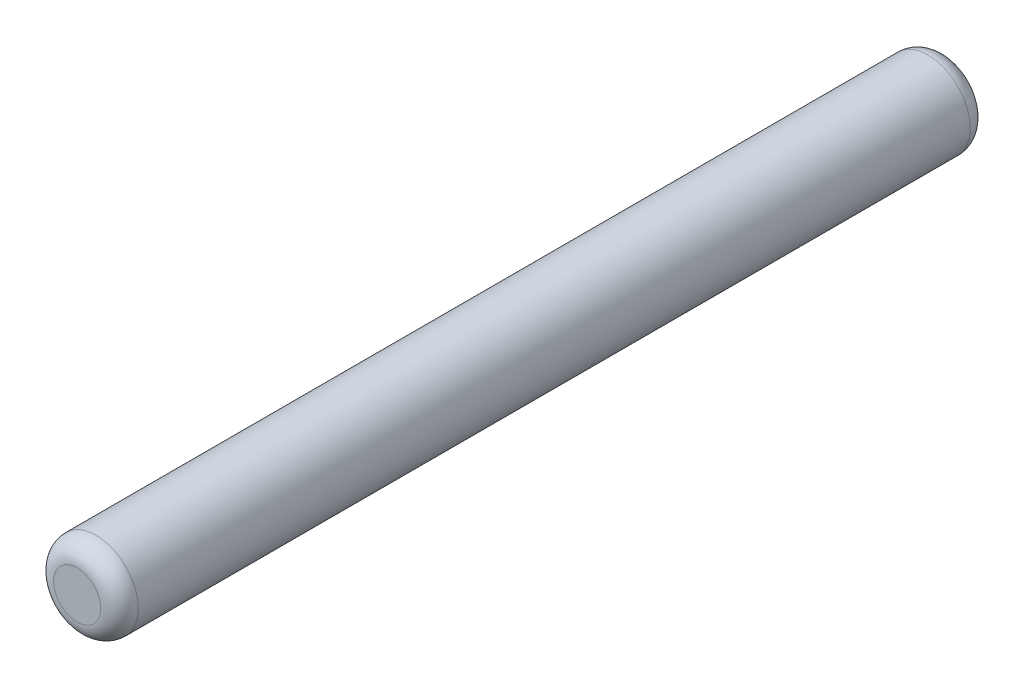
ISO-10303-21;
HEADER;
FILE_DESCRIPTION(('STEP AP214'),'2;1');
FILE_NAME('part.step','',(''),(''),'','','');
FILE_SCHEMA(('AUTOMOTIVE_DESIGN { 1 0 10303 214 1 1 1 1 }'));
ENDSEC;
DATA;
#1=APPLICATION_CONTEXT('core data for automotive mechanical design processes');
#2=APPLICATION_PROTOCOL_DEFINITION('international standard','automotive_design',2000,#1);
#3=PRODUCT_CONTEXT('',#1,'mechanical');
#4=PRODUCT('Part','Part','',(#3));
#5=PRODUCT_RELATED_PRODUCT_CATEGORY('part','',(#4));
#6=PRODUCT_DEFINITION_FORMATION('','',#4);
#7=PRODUCT_DEFINITION_CONTEXT('part definition',#1,'design');
#8=PRODUCT_DEFINITION('design','',#6,#7);
#9=PRODUCT_DEFINITION_SHAPE('','',#8);
#10=(LENGTH_UNIT() NAMED_UNIT(*) SI_UNIT(.MILLI.,.METRE.));
#11=(NAMED_UNIT(*) PLANE_ANGLE_UNIT() SI_UNIT($,.RADIAN.));
#12=(NAMED_UNIT(*) SI_UNIT($,.STERADIAN.) SOLID_ANGLE_UNIT());
#13=UNCERTAINTY_MEASURE_WITH_UNIT(LENGTH_MEASURE(1.E-05),#10,'distance_accuracy_value','');
#14=(GEOMETRIC_REPRESENTATION_CONTEXT(3) GLOBAL_UNCERTAINTY_ASSIGNED_CONTEXT((#13)) GLOBAL_UNIT_ASSIGNED_CONTEXT((#10,
#11,#12)) REPRESENTATION_CONTEXT('',''));
#15=CARTESIAN_POINT('',(0.,0.,0.));
#16=DIRECTION('',(0.,0.,1.));
#17=DIRECTION('',(1.,0.,0.));
#18=AXIS2_PLACEMENT_3D('',#15,#16,#17);
#19=CARTESIAN_POINT('',(0.,0.,37.));
#20=DIRECTION('',(0.,0.,-1.));
#21=DIRECTION('',(-1.,0.,0.));
#22=AXIS2_PLACEMENT_3D('',#19,#20,#21);
#23=CYLINDRICAL_SURFACE('',#22,1.8);
#24=CARTESIAN_POINT('',(0.,0.,0.800000000000002));
#25=DIRECTION('',(0.,0.,1.));
#26=DIRECTION('',(1.,0.,0.));
#27=AXIS2_PLACEMENT_3D('',#24,#25,#26);
#28=CIRCLE('',#27,1.8);
#29=CARTESIAN_POINT('',(1.8,0.,0.800000000000002));
#30=VERTEX_POINT('',#29);
#31=EDGE_CURVE('E42',#30,#30,#28,.T.);
#32=ORIENTED_EDGE('',*,*,#31,.T.);
#33=EDGE_LOOP('',(#32));
#34=FACE_BOUND('',#33,.T.);
#35=CARTESIAN_POINT('',(0.,0.,36.2));
#36=DIRECTION('',(0.,0.,1.));
#37=DIRECTION('',(1.,0.,0.));
#38=AXIS2_PLACEMENT_3D('',#35,#36,#37);
#39=CIRCLE('',#38,1.8);
#40=CARTESIAN_POINT('',(1.8,0.,36.2));
#41=VERTEX_POINT('',#40);
#42=EDGE_CURVE('E46',#41,#41,#39,.F.);
#43=ORIENTED_EDGE('',*,*,#42,.T.);
#44=EDGE_LOOP('',(#43));
#45=FACE_BOUND('',#44,.T.);
#46=ADVANCED_FACE('F31',(#34,#45),#23,.T.);
#47=CARTESIAN_POINT('',(0.,0.,37.));
#48=DIRECTION('',(0.,0.,1.));
#49=DIRECTION('',(1.,0.,0.));
#50=AXIS2_PLACEMENT_3D('',#47,#48,#49);
#51=PLANE('',#50);
#52=CARTESIAN_POINT('',(0.,0.,37.));
#53=DIRECTION('',(0.,0.,1.));
#54=DIRECTION('',(1.,0.,0.));
#55=AXIS2_PLACEMENT_3D('',#52,#53,#54);
#56=CIRCLE('',#55,1.);
#57=CARTESIAN_POINT('',(1.,0.,37.));
#58=VERTEX_POINT('',#57);
#59=EDGE_CURVE('E10',#58,#58,#56,.T.);
#60=ORIENTED_EDGE('',*,*,#59,.T.);
#61=EDGE_LOOP('',(#60));
#62=FACE_BOUND('',#61,.T.);
#63=ADVANCED_FACE('F62',(#62),#51,.T.);
#64=CARTESIAN_POINT('',(0.,0.,0.));
#65=DIRECTION('',(0.,0.,1.));
#66=DIRECTION('',(1.,0.,0.));
#67=AXIS2_PLACEMENT_3D('',#64,#65,#66);
#68=PLANE('',#67);
#69=CARTESIAN_POINT('',(0.,0.,0.));
#70=DIRECTION('',(0.,0.,1.));
#71=DIRECTION('',(1.,0.,0.));
#72=AXIS2_PLACEMENT_3D('',#69,#70,#71);
#73=CIRCLE('',#72,1.);
#74=CARTESIAN_POINT('',(1.,0.,0.));
#75=VERTEX_POINT('',#74);
#76=EDGE_CURVE('E38',#75,#75,#73,.F.);
#77=ORIENTED_EDGE('',*,*,#76,.T.);
#78=EDGE_LOOP('',(#77));
#79=FACE_BOUND('',#78,.T.);
#80=ADVANCED_FACE('F59',(#79),#68,.F.);
#81=CARTESIAN_POINT('',(0.,0.,0.800000000000002));
#82=DIRECTION('',(0.,0.,1.));
#83=DIRECTION('',(1.,0.,0.));
#84=AXIS2_PLACEMENT_3D('',#81,#82,#83);
#85=TOROIDAL_SURFACE('',#84,1.,0.8);
#86=ORIENTED_EDGE('',*,*,#76,.F.);
#87=EDGE_LOOP('',(#86));
#88=FACE_BOUND('',#87,.T.);
#89=ORIENTED_EDGE('',*,*,#31,.F.);
#90=EDGE_LOOP('',(#89));
#91=FACE_BOUND('',#90,.T.);
#92=ADVANCED_FACE('F55',(#88,#91),#85,.T.);
#93=CARTESIAN_POINT('',(0.,0.,36.2));
#94=DIRECTION('',(0.,0.,1.));
#95=DIRECTION('',(1.,0.,0.));
#96=AXIS2_PLACEMENT_3D('',#93,#94,#95);
#97=TOROIDAL_SURFACE('',#96,1.,0.8);
#98=ORIENTED_EDGE('',*,*,#42,.F.);
#99=EDGE_LOOP('',(#98));
#100=FACE_BOUND('',#99,.T.);
#101=ORIENTED_EDGE('',*,*,#59,.F.);
#102=EDGE_LOOP('',(#101));
#103=FACE_BOUND('',#102,.T.);
#104=ADVANCED_FACE('F33',(#100,#103),#97,.T.);
#105=CLOSED_SHELL('',(#46,#63,#80,#92,#104));
#106=MANIFOLD_SOLID_BREP('B2',#105);
#107=ADVANCED_BREP_SHAPE_REPRESENTATION('',(#18,#106),#14);
#108=SHAPE_DEFINITION_REPRESENTATION(#9,#107);
ENDSEC;
END-ISO-10303-21;
